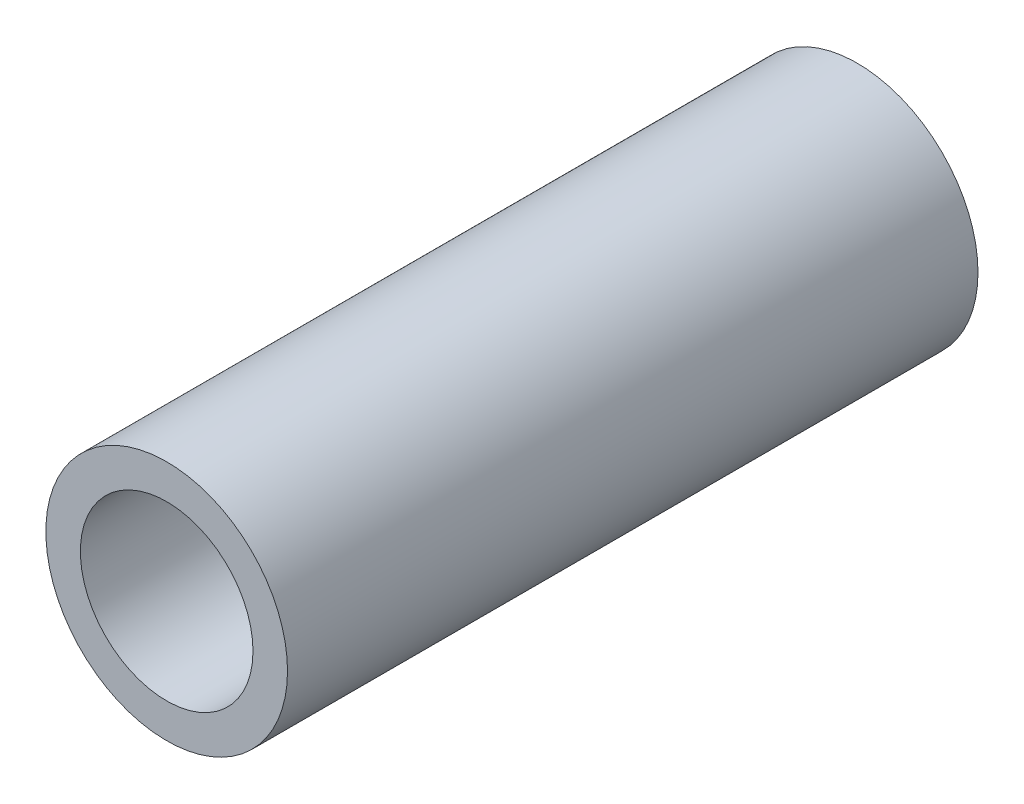
ISO-10303-21;
HEADER;
FILE_DESCRIPTION(('STEP AP214'),'2;1');
FILE_NAME('part.step','',(''),(''),'','','');
FILE_SCHEMA(('AUTOMOTIVE_DESIGN { 1 0 10303 214 1 1 1 1 }'));
ENDSEC;
DATA;
#1=APPLICATION_CONTEXT('core data for automotive mechanical design processes');
#2=APPLICATION_PROTOCOL_DEFINITION('international standard','automotive_design',2000,#1);
#3=PRODUCT_CONTEXT('',#1,'mechanical');
#4=PRODUCT('Part','Part','',(#3));
#5=PRODUCT_RELATED_PRODUCT_CATEGORY('part','',(#4));
#6=PRODUCT_DEFINITION_FORMATION('','',#4);
#7=PRODUCT_DEFINITION_CONTEXT('part definition',#1,'design');
#8=PRODUCT_DEFINITION('design','',#6,#7);
#9=PRODUCT_DEFINITION_SHAPE('','',#8);
#10=(LENGTH_UNIT() NAMED_UNIT(*) SI_UNIT(.MILLI.,.METRE.));
#11=(NAMED_UNIT(*) PLANE_ANGLE_UNIT() SI_UNIT($,.RADIAN.));
#12=(NAMED_UNIT(*) SI_UNIT($,.STERADIAN.) SOLID_ANGLE_UNIT());
#13=UNCERTAINTY_MEASURE_WITH_UNIT(LENGTH_MEASURE(1.E-05),#10,'distance_accuracy_value','');
#14=(GEOMETRIC_REPRESENTATION_CONTEXT(3) GLOBAL_UNCERTAINTY_ASSIGNED_CONTEXT((#13)) GLOBAL_UNIT_ASSIGNED_CONTEXT((#10,
#11,#12)) REPRESENTATION_CONTEXT('',''));
#15=CARTESIAN_POINT('',(0.,0.,0.));
#16=DIRECTION('',(0.,0.,1.));
#17=DIRECTION('',(1.,0.,0.));
#18=AXIS2_PLACEMENT_3D('',#15,#16,#17);
#19=CARTESIAN_POINT('',(0.,0.,30.));
#20=DIRECTION('',(0.,0.,1.));
#21=DIRECTION('',(1.,0.,0.));
#22=AXIS2_PLACEMENT_3D('',#19,#20,#21);
#23=PLANE('',#22);
#24=CARTESIAN_POINT('',(0.,0.,30.));
#25=DIRECTION('',(0.,0.,1.));
#26=DIRECTION('',(1.,0.,0.));
#27=AXIS2_PLACEMENT_3D('',#24,#25,#26);
#28=CIRCLE('',#27,10.5);
#29=CARTESIAN_POINT('',(10.5,0.,30.));
#30=VERTEX_POINT('',#29);
#31=EDGE_CURVE('E10',#30,#30,#28,.T.);
#32=ORIENTED_EDGE('',*,*,#31,.T.);
#33=EDGE_LOOP('',(#32));
#34=FACE_BOUND('',#33,.T.);
#35=CARTESIAN_POINT('',(0.,0.,30.));
#36=DIRECTION('',(0.,0.,1.));
#37=DIRECTION('',(1.,0.,0.));
#38=AXIS2_PLACEMENT_3D('',#35,#36,#37);
#39=CIRCLE('',#38,7.5);
#40=CARTESIAN_POINT('',(7.5,0.,30.));
#41=VERTEX_POINT('',#40);
#42=EDGE_CURVE('E50',#41,#41,#39,.T.);
#43=ORIENTED_EDGE('',*,*,#42,.F.);
#44=EDGE_LOOP('',(#43));
#45=FACE_BOUND('',#44,.T.);
#46=ADVANCED_FACE('F37',(#34,#45),#23,.T.);
#47=CARTESIAN_POINT('',(0.,0.,-30.));
#48=DIRECTION('',(0.,0.,1.));
#49=DIRECTION('',(1.,0.,0.));
#50=AXIS2_PLACEMENT_3D('',#47,#48,#49);
#51=PLANE('',#50);
#52=CARTESIAN_POINT('',(0.,0.,-30.));
#53=DIRECTION('',(0.,0.,1.));
#54=DIRECTION('',(1.,0.,0.));
#55=AXIS2_PLACEMENT_3D('',#52,#53,#54);
#56=CIRCLE('',#55,10.5);
#57=CARTESIAN_POINT('',(10.5,0.,-30.));
#58=VERTEX_POINT('',#57);
#59=EDGE_CURVE('E41',#58,#58,#56,.T.);
#60=ORIENTED_EDGE('',*,*,#59,.F.);
#61=EDGE_LOOP('',(#60));
#62=FACE_BOUND('',#61,.T.);
#63=CARTESIAN_POINT('',(0.,0.,-30.));
#64=DIRECTION('',(0.,0.,1.));
#65=DIRECTION('',(1.,0.,0.));
#66=AXIS2_PLACEMENT_3D('',#63,#64,#65);
#67=CIRCLE('',#66,7.5);
#68=CARTESIAN_POINT('',(7.5,0.,-30.));
#69=VERTEX_POINT('',#68);
#70=EDGE_CURVE('E52',#69,#69,#67,.T.);
#71=ORIENTED_EDGE('',*,*,#70,.T.);
#72=EDGE_LOOP('',(#71));
#73=FACE_BOUND('',#72,.T.);
#74=ADVANCED_FACE('F64',(#62,#73),#51,.F.);
#75=CARTESIAN_POINT('',(0.,0.,30.));
#76=DIRECTION('',(0.,0.,-1.));
#77=DIRECTION('',(-1.,0.,0.));
#78=AXIS2_PLACEMENT_3D('',#75,#76,#77);
#79=CYLINDRICAL_SURFACE('',#78,10.5);
#80=ORIENTED_EDGE('',*,*,#31,.F.);
#81=EDGE_LOOP('',(#80));
#82=FACE_BOUND('',#81,.T.);
#83=ORIENTED_EDGE('',*,*,#59,.T.);
#84=EDGE_LOOP('',(#83));
#85=FACE_BOUND('',#84,.T.);
#86=ADVANCED_FACE('F39',(#82,#85),#79,.T.);
#87=CARTESIAN_POINT('',(0.,0.,30.));
#88=DIRECTION('',(0.,0.,-1.));
#89=DIRECTION('',(-1.,0.,0.));
#90=AXIS2_PLACEMENT_3D('',#87,#88,#89);
#91=CYLINDRICAL_SURFACE('',#90,7.5);
#92=ORIENTED_EDGE('',*,*,#42,.T.);
#93=EDGE_LOOP('',(#92));
#94=FACE_BOUND('',#93,.T.);
#95=ORIENTED_EDGE('',*,*,#70,.F.);
#96=EDGE_LOOP('',(#95));
#97=FACE_BOUND('',#96,.T.);
#98=ADVANCED_FACE('F60',(#94,#97),#91,.F.);
#99=CLOSED_SHELL('',(#46,#74,#86,#98));
#100=MANIFOLD_SOLID_BREP('B2',#99);
#101=ADVANCED_BREP_SHAPE_REPRESENTATION('',(#18,#100),#14);
#102=SHAPE_DEFINITION_REPRESENTATION(#9,#101);
ENDSEC;
END-ISO-10303-21;
